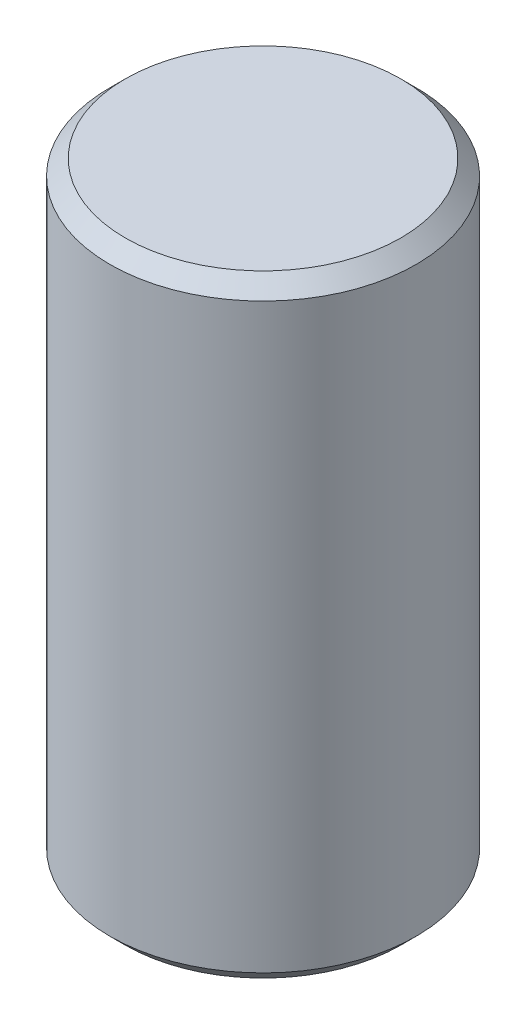
ISO-10303-21;
HEADER;
FILE_DESCRIPTION(('STEP AP214'),'2;1');
FILE_NAME('part.step','',(''),(''),'','','');
FILE_SCHEMA(('AUTOMOTIVE_DESIGN { 1 0 10303 214 1 1 1 1 }'));
ENDSEC;
DATA;
#1=APPLICATION_CONTEXT('core data for automotive mechanical design processes');
#2=APPLICATION_PROTOCOL_DEFINITION('international standard','automotive_design',2000,#1);
#3=PRODUCT_CONTEXT('',#1,'mechanical');
#4=PRODUCT('Part','Part','',(#3));
#5=PRODUCT_RELATED_PRODUCT_CATEGORY('part','',(#4));
#6=PRODUCT_DEFINITION_FORMATION('','',#4);
#7=PRODUCT_DEFINITION_CONTEXT('part definition',#1,'design');
#8=PRODUCT_DEFINITION('design','',#6,#7);
#9=PRODUCT_DEFINITION_SHAPE('','',#8);
#10=(LENGTH_UNIT() NAMED_UNIT(*) SI_UNIT(.MILLI.,.METRE.));
#11=(NAMED_UNIT(*) PLANE_ANGLE_UNIT() SI_UNIT($,.RADIAN.));
#12=(NAMED_UNIT(*) SI_UNIT($,.STERADIAN.) SOLID_ANGLE_UNIT());
#13=UNCERTAINTY_MEASURE_WITH_UNIT(LENGTH_MEASURE(1.E-05),#10,'distance_accuracy_value','');
#14=(GEOMETRIC_REPRESENTATION_CONTEXT(3) GLOBAL_UNCERTAINTY_ASSIGNED_CONTEXT((#13)) GLOBAL_UNIT_ASSIGNED_CONTEXT((#10,
#11,#12)) REPRESENTATION_CONTEXT('',''));
#15=CARTESIAN_POINT('',(0.,0.,0.));
#16=DIRECTION('',(0.,0.,1.));
#17=DIRECTION('',(1.,0.,0.));
#18=AXIS2_PLACEMENT_3D('',#15,#16,#17);
#19=CARTESIAN_POINT('',(0.,4.,0.));
#20=DIRECTION('',(0.,-1.,0.));
#21=DIRECTION('',(0.,0.,-1.));
#22=AXIS2_PLACEMENT_3D('',#19,#20,#21);
#23=CYLINDRICAL_SURFACE('',#22,1.);
#24=CARTESIAN_POINT('',(0.,0.0999999999999998,0.));
#25=DIRECTION('',(0.,1.,0.));
#26=DIRECTION('',(0.,0.,1.));
#27=AXIS2_PLACEMENT_3D('',#24,#25,#26);
#28=CIRCLE('',#27,1.);
#29=CARTESIAN_POINT('',(0.,0.0999999999999998,1.));
#30=VERTEX_POINT('',#29);
#31=EDGE_CURVE('E41',#30,#30,#28,.T.);
#32=ORIENTED_EDGE('',*,*,#31,.T.);
#33=EDGE_LOOP('',(#32));
#34=FACE_BOUND('',#33,.T.);
#35=CARTESIAN_POINT('',(0.,3.9,0.));
#36=DIRECTION('',(0.,1.,0.));
#37=DIRECTION('',(0.,0.,1.));
#38=AXIS2_PLACEMENT_3D('',#35,#36,#37);
#39=CIRCLE('',#38,1.);
#40=CARTESIAN_POINT('',(0.,3.9,1.));
#41=VERTEX_POINT('',#40);
#42=EDGE_CURVE('E45',#41,#41,#39,.F.);
#43=ORIENTED_EDGE('',*,*,#42,.T.);
#44=EDGE_LOOP('',(#43));
#45=FACE_BOUND('',#44,.T.);
#46=ADVANCED_FACE('F30',(#34,#45),#23,.T.);
#47=CARTESIAN_POINT('',(0.,4.,0.));
#48=DIRECTION('',(0.,1.,0.));
#49=DIRECTION('',(0.,0.,1.));
#50=AXIS2_PLACEMENT_3D('',#47,#48,#49);
#51=PLANE('',#50);
#52=CARTESIAN_POINT('',(0.,4.,0.));
#53=DIRECTION('',(0.,1.,0.));
#54=DIRECTION('',(0.,0.,1.));
#55=AXIS2_PLACEMENT_3D('',#52,#53,#54);
#56=CIRCLE('',#55,0.9);
#57=CARTESIAN_POINT('',(0.,4.,0.9));
#58=VERTEX_POINT('',#57);
#59=EDGE_CURVE('E10',#58,#58,#56,.T.);
#60=ORIENTED_EDGE('',*,*,#59,.T.);
#61=EDGE_LOOP('',(#60));
#62=FACE_BOUND('',#61,.T.);
#63=ADVANCED_FACE('F61',(#62),#51,.T.);
#64=CARTESIAN_POINT('',(0.,0.,0.));
#65=DIRECTION('',(0.,1.,0.));
#66=DIRECTION('',(0.,0.,1.));
#67=AXIS2_PLACEMENT_3D('',#64,#65,#66);
#68=PLANE('',#67);
#69=CARTESIAN_POINT('',(0.,0.,0.));
#70=DIRECTION('',(0.,1.,0.));
#71=DIRECTION('',(0.,0.,1.));
#72=AXIS2_PLACEMENT_3D('',#69,#70,#71);
#73=CIRCLE('',#72,0.9);
#74=CARTESIAN_POINT('',(0.,0.,0.9));
#75=VERTEX_POINT('',#74);
#76=EDGE_CURVE('E37',#75,#75,#73,.F.);
#77=ORIENTED_EDGE('',*,*,#76,.T.);
#78=EDGE_LOOP('',(#77));
#79=FACE_BOUND('',#78,.T.);
#80=ADVANCED_FACE('F58',(#79),#68,.F.);
#81=CARTESIAN_POINT('',(0.,0.0999999999999998,0.));
#82=DIRECTION('',(0.,1.,0.));
#83=DIRECTION('',(0.,0.,1.));
#84=AXIS2_PLACEMENT_3D('',#81,#82,#83);
#85=CONICAL_SURFACE('',#84,1.,0.78539816339745);
#86=CARTESIAN_POINT('',(0.,0.,0.9));
#87=CARTESIAN_POINT('',(0.,0.00104166666666664,0.901041666666666));
#88=CARTESIAN_POINT('',(0.,0.00208333333333331,0.902083333333333));
#89=CARTESIAN_POINT('',(0.,0.00416666666666665,0.904166666666666));
#90=CARTESIAN_POINT('',(0.,0.00520833333333332,0.905208333333333));
#91=CARTESIAN_POINT('',(0.,0.00729166666666665,0.907291666666666));
#92=CARTESIAN_POINT('',(0.,0.0083333333333333,0.908333333333333));
#93=CARTESIAN_POINT('',(0.,0.0104166666666666,0.910416666666666));
#94=CARTESIAN_POINT('',(0.,0.0114583333333333,0.911458333333333));
#95=CARTESIAN_POINT('',(0.,0.0135416666666666,0.913541666666666));
#96=CARTESIAN_POINT('',(0.,0.0145833333333333,0.914583333333333));
#97=CARTESIAN_POINT('',(0.,0.0166666666666666,0.916666666666666));
#98=CARTESIAN_POINT('',(0.,0.0177083333333333,0.917708333333333));
#99=CARTESIAN_POINT('',(0.,0.0197916666666666,0.919791666666666));
#100=CARTESIAN_POINT('',(0.,0.0208333333333333,0.920833333333333));
#101=CARTESIAN_POINT('',(0.,0.0229166666666666,0.922916666666666));
#102=CARTESIAN_POINT('',(0.,0.0239583333333333,0.923958333333333));
#103=CARTESIAN_POINT('',(0.,0.0260416666666666,0.926041666666666));
#104=CARTESIAN_POINT('',(0.,0.0270833333333333,0.927083333333333));
#105=CARTESIAN_POINT('',(0.,0.0291666666666666,0.929166666666666));
#106=CARTESIAN_POINT('',(0.,0.0302083333333333,0.930208333333333));
#107=CARTESIAN_POINT('',(0.,0.0322916666666666,0.932291666666666));
#108=CARTESIAN_POINT('',(0.,0.0333333333333333,0.933333333333333));
#109=CARTESIAN_POINT('',(0.,0.0354166666666666,0.935416666666667));
#110=CARTESIAN_POINT('',(0.,0.0364583333333333,0.936458333333333));
#111=CARTESIAN_POINT('',(0.,0.0385416666666666,0.938541666666666));
#112=CARTESIAN_POINT('',(0.,0.0395833333333333,0.939583333333333));
#113=CARTESIAN_POINT('',(0.,0.0416666666666666,0.941666666666667));
#114=CARTESIAN_POINT('',(0.,0.0427083333333333,0.942708333333333));
#115=CARTESIAN_POINT('',(0.,0.0447916666666666,0.944791666666666));
#116=CARTESIAN_POINT('',(0.,0.0458333333333332,0.945833333333333));
#117=CARTESIAN_POINT('',(0.,0.0479166666666666,0.947916666666667));
#118=CARTESIAN_POINT('',(0.,0.0489583333333332,0.948958333333333));
#119=CARTESIAN_POINT('',(0.,0.0510416666666666,0.951041666666667));
#120=CARTESIAN_POINT('',(0.,0.0520833333333332,0.952083333333333));
#121=CARTESIAN_POINT('',(0.,0.0541666666666666,0.954166666666666));
#122=CARTESIAN_POINT('',(0.,0.0552083333333332,0.955208333333333));
#123=CARTESIAN_POINT('',(0.,0.0572916666666666,0.957291666666667));
#124=CARTESIAN_POINT('',(0.,0.0583333333333332,0.958333333333333));
#125=CARTESIAN_POINT('',(0.,0.0604166666666665,0.960416666666667));
#126=CARTESIAN_POINT('',(0.,0.0614583333333332,0.961458333333333));
#127=CARTESIAN_POINT('',(0.,0.0635416666666666,0.963541666666667));
#128=CARTESIAN_POINT('',(0.,0.0645833333333332,0.964583333333333));
#129=CARTESIAN_POINT('',(0.,0.0666666666666666,0.966666666666667));
#130=CARTESIAN_POINT('',(0.,0.0677083333333332,0.967708333333333));
#131=CARTESIAN_POINT('',(0.,0.0697916666666666,0.969791666666666));
#132=CARTESIAN_POINT('',(0.,0.0708333333333332,0.970833333333333));
#133=CARTESIAN_POINT('',(0.,0.0729166666666665,0.972916666666667));
#134=CARTESIAN_POINT('',(0.,0.0739583333333332,0.973958333333333));
#135=CARTESIAN_POINT('',(0.,0.0760416666666665,0.976041666666667));
#136=CARTESIAN_POINT('',(0.,0.0770833333333332,0.977083333333333));
#137=CARTESIAN_POINT('',(0.,0.0791666666666665,0.979166666666667));
#138=CARTESIAN_POINT('',(0.,0.0802083333333332,0.980208333333333));
#139=CARTESIAN_POINT('',(0.,0.0822916666666666,0.982291666666667));
#140=CARTESIAN_POINT('',(0.,0.0833333333333332,0.983333333333333));
#141=CARTESIAN_POINT('',(0.,0.0854166666666665,0.985416666666667));
#142=CARTESIAN_POINT('',(0.,0.0864583333333332,0.986458333333333));
#143=CARTESIAN_POINT('',(0.,0.0885416666666665,0.988541666666667));
#144=CARTESIAN_POINT('',(0.,0.0895833333333332,0.989583333333333));
#145=CARTESIAN_POINT('',(0.,0.0916666666666665,0.991666666666667));
#146=CARTESIAN_POINT('',(0.,0.0927083333333332,0.992708333333333));
#147=CARTESIAN_POINT('',(0.,0.0947916666666665,0.994791666666667));
#148=CARTESIAN_POINT('',(0.,0.0958333333333332,0.995833333333333));
#149=CARTESIAN_POINT('',(0.,0.0979166666666665,0.997916666666666));
#150=CARTESIAN_POINT('',(0.,0.0989583333333332,0.998958333333333));
#151=CARTESIAN_POINT('',(0.,0.0999999999999998,1.));
#152=B_SPLINE_CURVE_WITH_KNOTS('',3,(#86,#87,#88,#89,#90,#91,#92,#93,#94,#95,#96,#97,#98,#99,
#100,#101,#102,#103,#104,#105,#106,#107,#108,#109,#110,#111,#112,#113,#114,#115,#116,#117,#118,
#119,#120,#121,#122,#123,#124,#125,#126,#127,#128,#129,#130,#131,#132,#133,#134,#135,#136,#137,
#138,#139,#140,#141,#142,#143,#144,#145,#146,#147,#148,#149,#150,#151),.UNSPECIFIED.,.F.,.F.,(4,
2,2,2,2,2,2,2,2,2,2,2,2,2,2,2,2,2,2,2,2,2,2,2,2,2,2,2,2,2,2,2,4),(0.,0.00441941738241591,
0.00883883476483181,0.0132582521472478,0.0176776695296637,0.0220970869120796,0.0265165042944955,
0.0309359216769115,0.0353553390593274,0.0397747564417433,0.0441941738241592,0.0486135912065752,
0.0530330085889911,0.057452425971407,0.0618718433538229,0.0662912607362389,0.0707106781186548,
0.0751300955010707,0.0795495128834866,0.0839689302659026,0.0883883476483185,0.0928077650307344,
0.0972271824131503,0.101646599795566,0.106066017177982,0.110485434560398,0.114904851942814,
0.11932426932523,0.123743686707646,0.128163104090062,0.132582521472478,0.137001938854894,
0.14142135623731),.UNSPECIFIED.);
#153=EDGE_CURVE('BSEAM54',#75,#30,#152,.T.);
#154=ORIENTED_EDGE('',*,*,#76,.F.);
#155=ORIENTED_EDGE('',*,*,#31,.F.);
#156=ORIENTED_EDGE('',*,*,#153,.T.);
#157=ORIENTED_EDGE('',*,*,#153,.F.);
#158=EDGE_LOOP('',(#154,#156,#155,#157));
#159=FACE_BOUND('',#158,.T.);
#160=ADVANCED_FACE('F54',(#159),#85,.T.);
#161=CARTESIAN_POINT('',(0.,4.,0.));
#162=DIRECTION('',(0.,-1.,0.));
#163=DIRECTION('',(0.,0.,-1.));
#164=AXIS2_PLACEMENT_3D('',#161,#162,#163);
#165=CONICAL_SURFACE('',#164,0.9,0.785398163397448);
#166=ORIENTED_EDGE('',*,*,#42,.F.);
#167=EDGE_LOOP('',(#166));
#168=FACE_BOUND('',#167,.T.);
#169=ORIENTED_EDGE('',*,*,#59,.F.);
#170=EDGE_LOOP('',(#169));
#171=FACE_BOUND('',#170,.T.);
#172=ADVANCED_FACE('F32',(#168,#171),#165,.T.);
#173=CLOSED_SHELL('',(#46,#63,#80,#160,#172));
#174=MANIFOLD_SOLID_BREP('B2',#173);
#175=ADVANCED_BREP_SHAPE_REPRESENTATION('',(#18,#174),#14);
#176=SHAPE_DEFINITION_REPRESENTATION(#9,#175);
ENDSEC;
END-ISO-10303-21;
